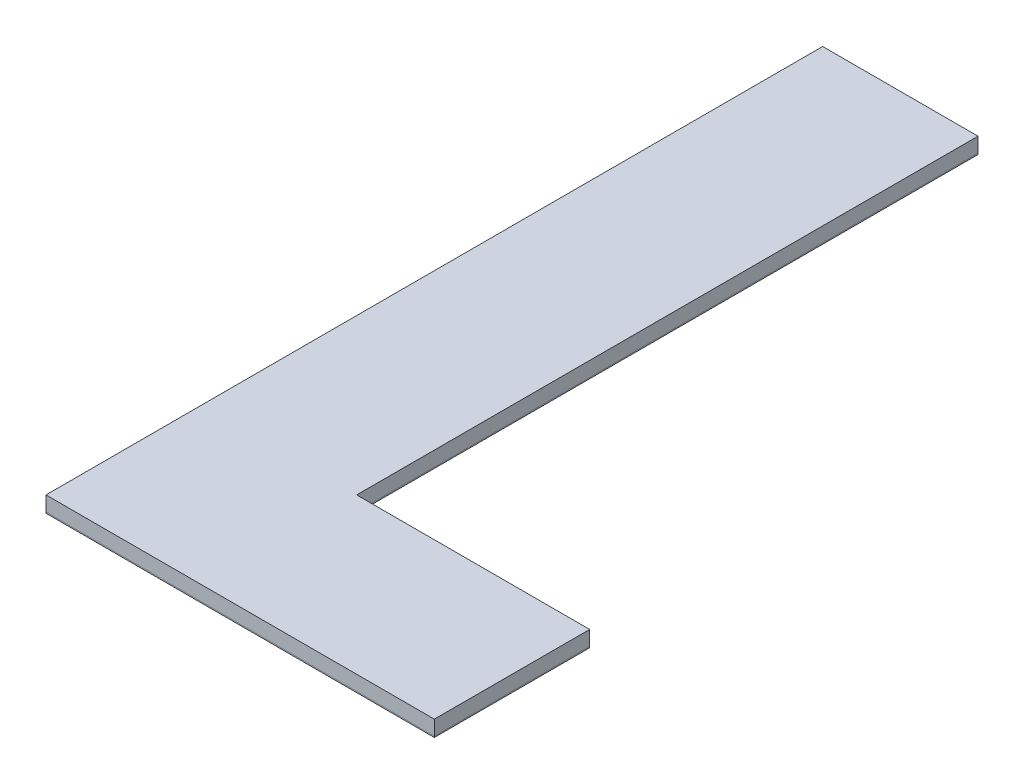
ISO-10303-21;
HEADER;
FILE_DESCRIPTION(('STEP AP214'),'2;1');
FILE_NAME('part.step','',(''),(''),'','','');
FILE_SCHEMA(('AUTOMOTIVE_DESIGN { 1 0 10303 214 1 1 1 1 }'));
ENDSEC;
DATA;
#1=APPLICATION_CONTEXT('core data for automotive mechanical design processes');
#2=APPLICATION_PROTOCOL_DEFINITION('international standard','automotive_design',2000,#1);
#3=PRODUCT_CONTEXT('',#1,'mechanical');
#4=PRODUCT('Part','Part','',(#3));
#5=PRODUCT_RELATED_PRODUCT_CATEGORY('part','',(#4));
#6=PRODUCT_DEFINITION_FORMATION('','',#4);
#7=PRODUCT_DEFINITION_CONTEXT('part definition',#1,'design');
#8=PRODUCT_DEFINITION('design','',#6,#7);
#9=PRODUCT_DEFINITION_SHAPE('','',#8);
#10=(LENGTH_UNIT() NAMED_UNIT(*) SI_UNIT(.MILLI.,.METRE.));
#11=(NAMED_UNIT(*) PLANE_ANGLE_UNIT() SI_UNIT($,.RADIAN.));
#12=(NAMED_UNIT(*) SI_UNIT($,.STERADIAN.) SOLID_ANGLE_UNIT());
#13=UNCERTAINTY_MEASURE_WITH_UNIT(LENGTH_MEASURE(1.E-05),#10,'distance_accuracy_value','');
#14=(GEOMETRIC_REPRESENTATION_CONTEXT(3) GLOBAL_UNCERTAINTY_ASSIGNED_CONTEXT((#13)) GLOBAL_UNIT_ASSIGNED_CONTEXT((#10,
#11,#12)) REPRESENTATION_CONTEXT('',''));
#15=CARTESIAN_POINT('',(0.,0.,0.));
#16=DIRECTION('',(0.,0.,1.));
#17=DIRECTION('',(1.,0.,0.));
#18=AXIS2_PLACEMENT_3D('',#15,#16,#17);
#19=CARTESIAN_POINT('',(0.,0.,0.));
#20=DIRECTION('',(0.,0.,-1.));
#21=DIRECTION('',(0.,-1.,0.));
#22=AXIS2_PLACEMENT_3D('',#19,#20,#21);
#23=PLANE('',#22);
#24=DIRECTION('',(0.,-1.,0.));
#25=VECTOR('',#24,1.);
#26=CARTESIAN_POINT('',(-300.,0.,0.));
#27=LINE('',#26,#25);
#28=CARTESIAN_POINT('',(-300.,19.,0.));
#29=VERTEX_POINT('',#28);
#30=CARTESIAN_POINT('',(-300.,0.,0.));
#31=VERTEX_POINT('',#30);
#32=EDGE_CURVE('P0_E118',#29,#31,#27,.T.);
#33=ORIENTED_EDGE('',*,*,#32,.T.);
#34=DIRECTION('',(-1.,0.,0.));
#35=VECTOR('',#34,1.);
#36=CARTESIAN_POINT('',(0.,0.,0.));
#37=LINE('',#36,#35);
#38=CARTESIAN_POINT('',(-500.,0.,0.));
#39=VERTEX_POINT('',#38);
#40=EDGE_CURVE('P0_E21',#31,#39,#37,.T.);
#41=ORIENTED_EDGE('',*,*,#40,.T.);
#42=DIRECTION('',(0.,1.,0.));
#43=VECTOR('',#42,1.);
#44=CARTESIAN_POINT('',(-500.,0.,0.));
#45=LINE('',#44,#43);
#46=CARTESIAN_POINT('',(-500.,19.,0.));
#47=VERTEX_POINT('',#46);
#48=EDGE_CURVE('P0_E11',#39,#47,#45,.T.);
#49=ORIENTED_EDGE('',*,*,#48,.T.);
#50=DIRECTION('',(-1.,0.,0.));
#51=VECTOR('',#50,1.);
#52=CARTESIAN_POINT('',(0.,19.,0.));
#53=LINE('',#52,#51);
#54=EDGE_CURVE('P0_E109',#29,#47,#53,.T.);
#55=ORIENTED_EDGE('',*,*,#54,.F.);
#56=EDGE_LOOP('',(#33,#41,#49,#55));
#57=FACE_BOUND('',#56,.T.);
#58=ADVANCED_FACE('P0_F17',(#57),#23,.T.);
#59=CARTESIAN_POINT('',(-500.,0.,0.));
#60=DIRECTION('',(-1.,0.,0.));
#61=DIRECTION('',(0.,1.,0.));
#62=AXIS2_PLACEMENT_3D('',#59,#60,#61);
#63=PLANE('',#62);
#64=DIRECTION('',(0.,0.,1.));
#65=VECTOR('',#64,1.);
#66=CARTESIAN_POINT('',(-500.,0.,0.));
#67=LINE('',#66,#65);
#68=CARTESIAN_POINT('',(-500.,0.,1000.));
#69=VERTEX_POINT('',#68);
#70=EDGE_CURVE('P0_E142',#39,#69,#67,.T.);
#71=ORIENTED_EDGE('',*,*,#70,.T.);
#72=DIRECTION('',(0.,1.,0.));
#73=VECTOR('',#72,1.);
#74=CARTESIAN_POINT('',(-500.,0.,1000.));
#75=LINE('',#74,#73);
#76=CARTESIAN_POINT('',(-500.,19.,1000.));
#77=VERTEX_POINT('',#76);
#78=EDGE_CURVE('P0_E28',#69,#77,#75,.T.);
#79=ORIENTED_EDGE('',*,*,#78,.T.);
#80=DIRECTION('',(0.,0.,1.));
#81=VECTOR('',#80,1.);
#82=CARTESIAN_POINT('',(-500.,19.,0.));
#83=LINE('',#82,#81);
#84=EDGE_CURVE('P0_E148',#47,#77,#83,.T.);
#85=ORIENTED_EDGE('',*,*,#84,.F.);
#86=ORIENTED_EDGE('',*,*,#48,.F.);
#87=EDGE_LOOP('',(#71,#79,#85,#86));
#88=FACE_BOUND('',#87,.T.);
#89=ADVANCED_FACE('P0_F302',(#88),#63,.T.);
#90=CARTESIAN_POINT('',(-500.,0.,1000.));
#91=DIRECTION('',(0.,0.,1.));
#92=DIRECTION('',(1.,0.,0.));
#93=AXIS2_PLACEMENT_3D('',#90,#91,#92);
#94=PLANE('',#93);
#95=DIRECTION('',(1.,0.,0.));
#96=VECTOR('',#95,1.);
#97=CARTESIAN_POINT('',(-500.,0.,1000.));
#98=LINE('',#97,#96);
#99=CARTESIAN_POINT('',(0.,0.,1000.));
#100=VERTEX_POINT('',#99);
#101=EDGE_CURVE('P0_E141',#69,#100,#98,.T.);
#102=ORIENTED_EDGE('',*,*,#101,.T.);
#103=DIRECTION('',(0.,1.,0.));
#104=VECTOR('',#103,1.);
#105=CARTESIAN_POINT('',(0.,0.,1000.));
#106=LINE('',#105,#104);
#107=CARTESIAN_POINT('',(0.,19.,1000.));
#108=VERTEX_POINT('',#107);
#109=EDGE_CURVE('P0_E92',#100,#108,#106,.T.);
#110=ORIENTED_EDGE('',*,*,#109,.T.);
#111=DIRECTION('',(1.,0.,0.));
#112=VECTOR('',#111,1.);
#113=CARTESIAN_POINT('',(-500.,19.,1000.));
#114=LINE('',#113,#112);
#115=EDGE_CURVE('P0_E145',#77,#108,#114,.T.);
#116=ORIENTED_EDGE('',*,*,#115,.F.);
#117=ORIENTED_EDGE('',*,*,#78,.F.);
#118=EDGE_LOOP('',(#102,#110,#116,#117));
#119=FACE_BOUND('',#118,.T.);
#120=ADVANCED_FACE('P0_F295',(#119),#94,.T.);
#121=CARTESIAN_POINT('',(0.,0.,1000.));
#122=DIRECTION('',(1.,0.,0.));
#123=DIRECTION('',(0.,1.,0.));
#124=AXIS2_PLACEMENT_3D('',#121,#122,#123);
#125=PLANE('',#124);
#126=DIRECTION('',(0.,1.,0.));
#127=VECTOR('',#126,1.);
#128=CARTESIAN_POINT('',(0.,0.,800.));
#129=LINE('',#128,#127);
#130=CARTESIAN_POINT('',(0.,0.,800.));
#131=VERTEX_POINT('',#130);
#132=CARTESIAN_POINT('',(0.,19.,800.));
#133=VERTEX_POINT('',#132);
#134=EDGE_CURVE('P0_E106',#131,#133,#129,.T.);
#135=ORIENTED_EDGE('',*,*,#134,.T.);
#136=DIRECTION('',(0.,0.,-1.));
#137=VECTOR('',#136,1.);
#138=CARTESIAN_POINT('',(0.,19.,1000.));
#139=LINE('',#138,#137);
#140=EDGE_CURVE('P0_E77',#108,#133,#139,.T.);
#141=ORIENTED_EDGE('',*,*,#140,.F.);
#142=ORIENTED_EDGE('',*,*,#109,.F.);
#143=DIRECTION('',(0.,0.,-1.));
#144=VECTOR('',#143,1.);
#145=CARTESIAN_POINT('',(0.,0.,1000.));
#146=LINE('',#145,#144);
#147=EDGE_CURVE('P0_E62',#100,#131,#146,.T.);
#148=ORIENTED_EDGE('',*,*,#147,.T.);
#149=EDGE_LOOP('',(#135,#141,#142,#148));
#150=FACE_BOUND('',#149,.T.);
#151=ADVANCED_FACE('P0_F161',(#150),#125,.T.);
#152=CARTESIAN_POINT('',(-250.,0.,500.));
#153=DIRECTION('',(0.,-1.,0.));
#154=DIRECTION('',(0.,0.,-1.));
#155=AXIS2_PLACEMENT_3D('',#152,#153,#154);
#156=PLANE('',#155);
#157=DIRECTION('',(0.,0.,1.));
#158=VECTOR('',#157,1.);
#159=CARTESIAN_POINT('',(-300.,0.,250.));
#160=LINE('',#159,#158);
#161=CARTESIAN_POINT('',(-300.,0.,800.));
#162=VERTEX_POINT('',#161);
#163=EDGE_CURVE('P0_E112',#31,#162,#160,.T.);
#164=ORIENTED_EDGE('',*,*,#163,.T.);
#165=DIRECTION('',(1.,0.,0.));
#166=VECTOR('',#165,1.);
#167=CARTESIAN_POINT('',(-275.,0.,800.));
#168=LINE('',#167,#166);
#169=EDGE_CURVE('P0_E99',#162,#131,#168,.T.);
#170=ORIENTED_EDGE('',*,*,#169,.T.);
#171=ORIENTED_EDGE('',*,*,#147,.F.);
#172=ORIENTED_EDGE('',*,*,#101,.F.);
#173=ORIENTED_EDGE('',*,*,#70,.F.);
#174=ORIENTED_EDGE('',*,*,#40,.F.);
#175=EDGE_LOOP('',(#164,#170,#171,#172,#173,#174));
#176=FACE_BOUND('',#175,.T.);
#177=ADVANCED_FACE('P0_F19',(#176),#156,.T.);
#178=CARTESIAN_POINT('',(-250.,19.,500.));
#179=DIRECTION('',(0.,1.,0.));
#180=DIRECTION('',(1.,0.,0.));
#181=AXIS2_PLACEMENT_3D('',#178,#179,#180);
#182=PLANE('',#181);
#183=DIRECTION('',(-1.,0.,0.));
#184=VECTOR('',#183,1.);
#185=CARTESIAN_POINT('',(-275.,19.,800.));
#186=LINE('',#185,#184);
#187=CARTESIAN_POINT('',(-300.,19.,800.));
#188=VERTEX_POINT('',#187);
#189=EDGE_CURVE('P0_E136',#133,#188,#186,.T.);
#190=ORIENTED_EDGE('',*,*,#189,.T.);
#191=DIRECTION('',(0.,0.,-1.));
#192=VECTOR('',#191,1.);
#193=CARTESIAN_POINT('',(-300.,19.,250.));
#194=LINE('',#193,#192);
#195=EDGE_CURVE('P0_E122',#188,#29,#194,.T.);
#196=ORIENTED_EDGE('',*,*,#195,.T.);
#197=ORIENTED_EDGE('',*,*,#54,.T.);
#198=ORIENTED_EDGE('',*,*,#84,.T.);
#199=ORIENTED_EDGE('',*,*,#115,.T.);
#200=ORIENTED_EDGE('',*,*,#140,.T.);
#201=EDGE_LOOP('',(#190,#196,#197,#198,#199,#200));
#202=FACE_BOUND('',#201,.T.);
#203=ADVANCED_FACE('P0_F162',(#202),#182,.T.);
#204=CARTESIAN_POINT('',(-300.,0.,800.));
#205=DIRECTION('',(0.,0.,1.));
#206=DIRECTION('',(1.,0.,0.));
#207=AXIS2_PLACEMENT_3D('',#204,#205,#206);
#208=PLANE('',#207);
#209=ORIENTED_EDGE('',*,*,#189,.F.);
#210=ORIENTED_EDGE('',*,*,#134,.F.);
#211=ORIENTED_EDGE('',*,*,#169,.F.);
#212=DIRECTION('',(0.,1.,0.));
#213=VECTOR('',#212,1.);
#214=CARTESIAN_POINT('',(-300.,0.,800.));
#215=LINE('',#214,#213);
#216=EDGE_CURVE('P0_E104',#162,#188,#215,.T.);
#217=ORIENTED_EDGE('',*,*,#216,.T.);
#218=EDGE_LOOP('',(#209,#210,#211,#217));
#219=FACE_BOUND('',#218,.T.);
#220=ADVANCED_FACE('P0_F102',(#219),#208,.F.);
#221=CARTESIAN_POINT('',(-300.,0.,0.));
#222=DIRECTION('',(-1.,0.,0.));
#223=DIRECTION('',(0.,0.,1.));
#224=AXIS2_PLACEMENT_3D('',#221,#222,#223);
#225=PLANE('',#224);
#226=ORIENTED_EDGE('',*,*,#195,.F.);
#227=ORIENTED_EDGE('',*,*,#216,.F.);
#228=ORIENTED_EDGE('',*,*,#163,.F.);
#229=ORIENTED_EDGE('',*,*,#32,.F.);
#230=EDGE_LOOP('',(#226,#227,#228,#229));
#231=FACE_BOUND('',#230,.T.);
#232=ADVANCED_FACE('P0_F120',(#231),#225,.F.);
#233=CLOSED_SHELL('',(#58,#89,#120,#151,#177,#203,#220,#232));
#234=MANIFOLD_SOLID_BREP('P0_B1',#233);
#235=CARTESIAN_POINT('',(-500.,0.,0.));
#236=DIRECTION('',(0.,0.,-1.));
#237=DIRECTION('',(0.,-1.,0.));
#238=AXIS2_PLACEMENT_3D('',#235,#236,#237);
#239=PLANE('',#238);
#240=DIRECTION('',(0.,-1.,0.));
#241=VECTOR('',#240,1.);
#242=CARTESIAN_POINT('',(-300.,-0.75,0.));
#243=LINE('',#242,#241);
#244=CARTESIAN_POINT('',(-300.,0.,0.));
#245=VERTEX_POINT('',#244);
#246=CARTESIAN_POINT('',(-300.,-1.5,0.));
#247=VERTEX_POINT('',#246);
#248=EDGE_CURVE('P1_E123',#245,#247,#243,.T.);
#249=ORIENTED_EDGE('',*,*,#248,.T.);
#250=DIRECTION('',(1.,0.,0.));
#251=VECTOR('',#250,1.);
#252=CARTESIAN_POINT('',(-500.,-1.5,0.));
#253=LINE('',#252,#251);
#254=CARTESIAN_POINT('',(-500.,-1.5,0.));
#255=VERTEX_POINT('',#254);
#256=EDGE_CURVE('P1_E116',#255,#247,#253,.T.);
#257=ORIENTED_EDGE('',*,*,#256,.F.);
#258=DIRECTION('',(0.,-1.,0.));
#259=VECTOR('',#258,1.);
#260=CARTESIAN_POINT('',(-500.,0.,0.));
#261=LINE('',#260,#259);
#262=CARTESIAN_POINT('',(-500.,0.,0.));
#263=VERTEX_POINT('',#262);
#264=EDGE_CURVE('P1_E40',#263,#255,#261,.T.);
#265=ORIENTED_EDGE('',*,*,#264,.F.);
#266=DIRECTION('',(1.,0.,0.));
#267=VECTOR('',#266,1.);
#268=CARTESIAN_POINT('',(-500.,0.,0.));
#269=LINE('',#268,#267);
#270=EDGE_CURVE('P1_E108',#263,#245,#269,.T.);
#271=ORIENTED_EDGE('',*,*,#270,.T.);
#272=EDGE_LOOP('',(#249,#257,#265,#271));
#273=FACE_BOUND('',#272,.T.);
#274=ADVANCED_FACE('P1_F17',(#273),#239,.T.);
#275=CARTESIAN_POINT('',(0.,0.,0.));
#276=DIRECTION('',(1.,0.,0.));
#277=DIRECTION('',(0.,1.,0.));
#278=AXIS2_PLACEMENT_3D('',#275,#276,#277);
#279=PLANE('',#278);
#280=DIRECTION('',(0.,1.,0.));
#281=VECTOR('',#280,1.);
#282=CARTESIAN_POINT('',(0.,-0.75,800.));
#283=LINE('',#282,#281);
#284=CARTESIAN_POINT('',(0.,-1.5,800.));
#285=VERTEX_POINT('',#284);
#286=CARTESIAN_POINT('',(0.,0.,800.));
#287=VERTEX_POINT('',#286);
#288=EDGE_CURVE('P1_E93',#285,#287,#283,.T.);
#289=ORIENTED_EDGE('',*,*,#288,.T.);
#290=DIRECTION('',(0.,0.,1.));
#291=VECTOR('',#290,1.);
#292=CARTESIAN_POINT('',(0.,0.,0.));
#293=LINE('',#292,#291);
#294=CARTESIAN_POINT('',(0.,0.,1000.));
#295=VERTEX_POINT('',#294);
#296=EDGE_CURVE('P1_E91',#287,#295,#293,.T.);
#297=ORIENTED_EDGE('',*,*,#296,.T.);
#298=DIRECTION('',(0.,-1.,0.));
#299=VECTOR('',#298,1.);
#300=CARTESIAN_POINT('',(0.,0.,1000.));
#301=LINE('',#300,#299);
#302=CARTESIAN_POINT('',(0.,-1.5,1000.));
#303=VERTEX_POINT('',#302);
#304=EDGE_CURVE('P1_E11',#295,#303,#301,.T.);
#305=ORIENTED_EDGE('',*,*,#304,.T.);
#306=DIRECTION('',(0.,0.,1.));
#307=VECTOR('',#306,1.);
#308=CARTESIAN_POINT('',(0.,-1.5,0.));
#309=LINE('',#308,#307);
#310=EDGE_CURVE('P1_E97',#285,#303,#309,.T.);
#311=ORIENTED_EDGE('',*,*,#310,.F.);
#312=EDGE_LOOP('',(#289,#297,#305,#311));
#313=FACE_BOUND('',#312,.T.);
#314=ADVANCED_FACE('P1_F19',(#313),#279,.T.);
#315=CARTESIAN_POINT('',(0.,0.,1000.));
#316=DIRECTION('',(0.,0.,1.));
#317=DIRECTION('',(1.,0.,0.));
#318=AXIS2_PLACEMENT_3D('',#315,#316,#317);
#319=PLANE('',#318);
#320=DIRECTION('',(-1.,0.,0.));
#321=VECTOR('',#320,1.);
#322=CARTESIAN_POINT('',(0.,0.,1000.));
#323=LINE('',#322,#321);
#324=CARTESIAN_POINT('',(-500.,0.,1000.));
#325=VERTEX_POINT('',#324);
#326=EDGE_CURVE('P1_E84',#295,#325,#323,.T.);
#327=ORIENTED_EDGE('',*,*,#326,.T.);
#328=DIRECTION('',(0.,-1.,0.));
#329=VECTOR('',#328,1.);
#330=CARTESIAN_POINT('',(-500.,0.,1000.));
#331=LINE('',#330,#329);
#332=CARTESIAN_POINT('',(-500.,-1.5,1000.));
#333=VERTEX_POINT('',#332);
#334=EDGE_CURVE('P1_E27',#325,#333,#331,.T.);
#335=ORIENTED_EDGE('',*,*,#334,.T.);
#336=DIRECTION('',(-1.,0.,0.));
#337=VECTOR('',#336,1.);
#338=CARTESIAN_POINT('',(0.,-1.5,1000.));
#339=LINE('',#338,#337);
#340=EDGE_CURVE('P1_E87',#303,#333,#339,.T.);
#341=ORIENTED_EDGE('',*,*,#340,.F.);
#342=ORIENTED_EDGE('',*,*,#304,.F.);
#343=EDGE_LOOP('',(#327,#335,#341,#342));
#344=FACE_BOUND('',#343,.T.);
#345=ADVANCED_FACE('P1_F82',(#344),#319,.T.);
#346=CARTESIAN_POINT('',(-500.,0.,1000.));
#347=DIRECTION('',(-1.,0.,0.));
#348=DIRECTION('',(0.,1.,0.));
#349=AXIS2_PLACEMENT_3D('',#346,#347,#348);
#350=PLANE('',#349);
#351=DIRECTION('',(0.,0.,-1.));
#352=VECTOR('',#351,1.);
#353=CARTESIAN_POINT('',(-500.,0.,1000.));
#354=LINE('',#353,#352);
#355=EDGE_CURVE('P1_E101',#325,#263,#354,.T.);
#356=ORIENTED_EDGE('',*,*,#355,.T.);
#357=ORIENTED_EDGE('',*,*,#264,.T.);
#358=DIRECTION('',(0.,0.,-1.));
#359=VECTOR('',#358,1.);
#360=CARTESIAN_POINT('',(-500.,-1.5,1000.));
#361=LINE('',#360,#359);
#362=EDGE_CURVE('P1_E119',#333,#255,#361,.T.);
#363=ORIENTED_EDGE('',*,*,#362,.F.);
#364=ORIENTED_EDGE('',*,*,#334,.F.);
#365=EDGE_LOOP('',(#356,#357,#363,#364));
#366=FACE_BOUND('',#365,.T.);
#367=ADVANCED_FACE('P1_F159',(#366),#350,.T.);
#368=CARTESIAN_POINT('',(-250.,-1.5,500.));
#369=DIRECTION('',(0.,-1.,0.));
#370=DIRECTION('',(0.,0.,-1.));
#371=AXIS2_PLACEMENT_3D('',#368,#369,#370);
#372=PLANE('',#371);
#373=DIRECTION('',(0.,0.,1.));
#374=VECTOR('',#373,1.);
#375=CARTESIAN_POINT('',(-300.,-1.5,250.));
#376=LINE('',#375,#374);
#377=CARTESIAN_POINT('',(-300.,-1.5,800.));
#378=VERTEX_POINT('',#377);
#379=EDGE_CURVE('P1_E128',#247,#378,#376,.T.);
#380=ORIENTED_EDGE('',*,*,#379,.T.);
#381=DIRECTION('',(1.,0.,0.));
#382=VECTOR('',#381,1.);
#383=CARTESIAN_POINT('',(-275.,-1.5,800.));
#384=LINE('',#383,#382);
#385=EDGE_CURVE('P1_E112',#378,#285,#384,.T.);
#386=ORIENTED_EDGE('',*,*,#385,.T.);
#387=ORIENTED_EDGE('',*,*,#310,.T.);
#388=ORIENTED_EDGE('',*,*,#340,.T.);
#389=ORIENTED_EDGE('',*,*,#362,.T.);
#390=ORIENTED_EDGE('',*,*,#256,.T.);
#391=EDGE_LOOP('',(#380,#386,#387,#388,#389,#390));
#392=FACE_BOUND('',#391,.T.);
#393=ADVANCED_FACE('P1_F158',(#392),#372,.T.);
#394=CARTESIAN_POINT('',(-250.,0.,500.));
#395=DIRECTION('',(0.,-1.,0.));
#396=DIRECTION('',(0.,0.,-1.));
#397=AXIS2_PLACEMENT_3D('',#394,#395,#396);
#398=PLANE('',#397);
#399=DIRECTION('',(-1.,0.,0.));
#400=VECTOR('',#399,1.);
#401=CARTESIAN_POINT('',(-275.,0.,800.));
#402=LINE('',#401,#400);
#403=CARTESIAN_POINT('',(-300.,0.,800.));
#404=VERTEX_POINT('',#403);
#405=EDGE_CURVE('P1_E127',#287,#404,#402,.T.);
#406=ORIENTED_EDGE('',*,*,#405,.T.);
#407=DIRECTION('',(0.,0.,-1.));
#408=VECTOR('',#407,1.);
#409=CARTESIAN_POINT('',(-300.,0.,250.));
#410=LINE('',#409,#408);
#411=EDGE_CURVE('P1_E129',#404,#245,#410,.T.);
#412=ORIENTED_EDGE('',*,*,#411,.T.);
#413=ORIENTED_EDGE('',*,*,#270,.F.);
#414=ORIENTED_EDGE('',*,*,#355,.F.);
#415=ORIENTED_EDGE('',*,*,#326,.F.);
#416=ORIENTED_EDGE('',*,*,#296,.F.);
#417=EDGE_LOOP('',(#406,#412,#413,#414,#415,#416));
#418=FACE_BOUND('',#417,.T.);
#419=ADVANCED_FACE('P1_F99',(#418),#398,.F.);
#420=CARTESIAN_POINT('',(-300.,-1.5,800.));
#421=DIRECTION('',(0.,0.,1.));
#422=DIRECTION('',(1.,0.,0.));
#423=AXIS2_PLACEMENT_3D('',#420,#421,#422);
#424=PLANE('',#423);
#425=ORIENTED_EDGE('',*,*,#405,.F.);
#426=ORIENTED_EDGE('',*,*,#288,.F.);
#427=ORIENTED_EDGE('',*,*,#385,.F.);
#428=DIRECTION('',(0.,1.,0.));
#429=VECTOR('',#428,1.);
#430=CARTESIAN_POINT('',(-300.,-1.5,800.));
#431=LINE('',#430,#429);
#432=EDGE_CURVE('P1_E133',#378,#404,#431,.T.);
#433=ORIENTED_EDGE('',*,*,#432,.T.);
#434=EDGE_LOOP('',(#425,#426,#427,#433));
#435=FACE_BOUND('',#434,.T.);
#436=ADVANCED_FACE('P1_F156',(#435),#424,.F.);
#437=CARTESIAN_POINT('',(-300.,-1.5,0.));
#438=DIRECTION('',(-1.,0.,0.));
#439=DIRECTION('',(0.,0.,1.));
#440=AXIS2_PLACEMENT_3D('',#437,#438,#439);
#441=PLANE('',#440);
#442=ORIENTED_EDGE('',*,*,#411,.F.);
#443=ORIENTED_EDGE('',*,*,#432,.F.);
#444=ORIENTED_EDGE('',*,*,#379,.F.);
#445=ORIENTED_EDGE('',*,*,#248,.F.);
#446=EDGE_LOOP('',(#442,#443,#444,#445));
#447=FACE_BOUND('',#446,.T.);
#448=ADVANCED_FACE('P1_F151',(#447),#441,.F.);
#449=CLOSED_SHELL('',(#274,#314,#345,#367,#393,#419,#436,#448));
#450=MANIFOLD_SOLID_BREP('P1_B1',#449);
#451=ADVANCED_BREP_SHAPE_REPRESENTATION('',(#18,#234,#450),#14);
#452=SHAPE_DEFINITION_REPRESENTATION(#9,#451);
ENDSEC;
END-ISO-10303-21;
